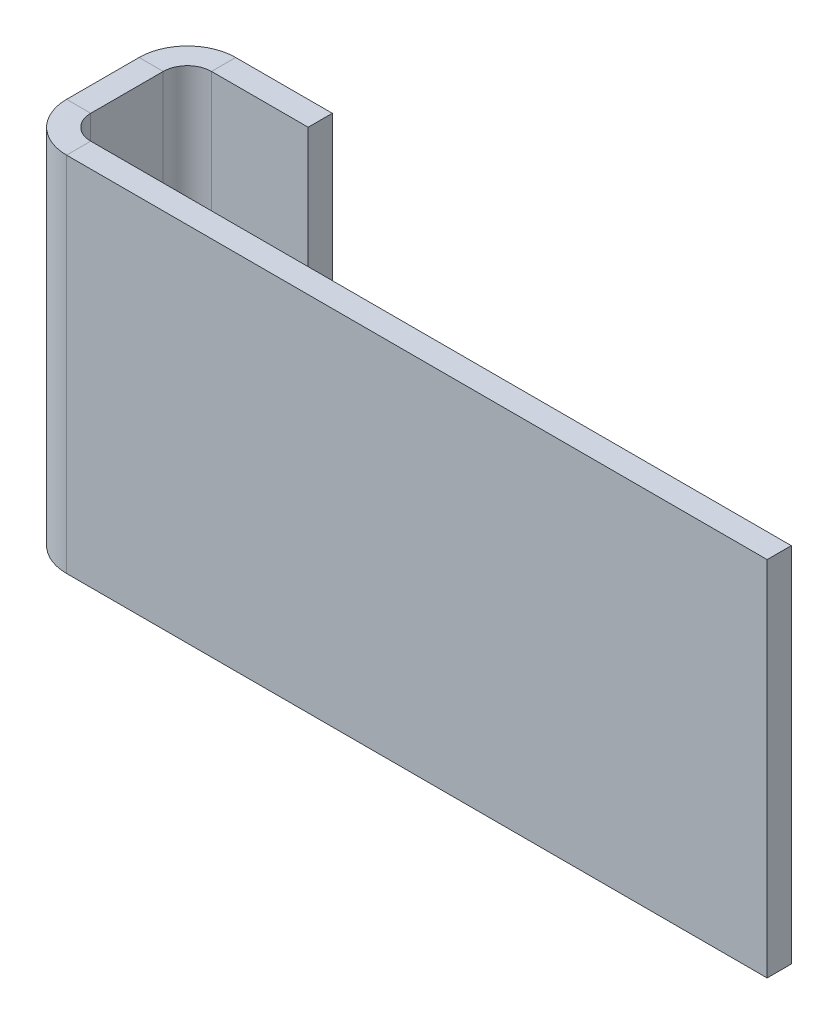
ISO-10303-21;
HEADER;
FILE_DESCRIPTION(('STEP AP214'),'2;1');
FILE_NAME('part.step','',(''),(''),'','','');
FILE_SCHEMA(('AUTOMOTIVE_DESIGN { 1 0 10303 214 1 1 1 1 }'));
ENDSEC;
DATA;
#1=APPLICATION_CONTEXT('core data for automotive mechanical design processes');
#2=APPLICATION_PROTOCOL_DEFINITION('international standard','automotive_design',2000,#1);
#3=PRODUCT_CONTEXT('',#1,'mechanical');
#4=PRODUCT('Part','Part','',(#3));
#5=PRODUCT_RELATED_PRODUCT_CATEGORY('part','',(#4));
#6=PRODUCT_DEFINITION_FORMATION('','',#4);
#7=PRODUCT_DEFINITION_CONTEXT('part definition',#1,'design');
#8=PRODUCT_DEFINITION('design','',#6,#7);
#9=PRODUCT_DEFINITION_SHAPE('','',#8);
#10=(LENGTH_UNIT() NAMED_UNIT(*) SI_UNIT(.MILLI.,.METRE.));
#11=(NAMED_UNIT(*) PLANE_ANGLE_UNIT() SI_UNIT($,.RADIAN.));
#12=(NAMED_UNIT(*) SI_UNIT($,.STERADIAN.) SOLID_ANGLE_UNIT());
#13=UNCERTAINTY_MEASURE_WITH_UNIT(LENGTH_MEASURE(1.E-05),#10,'distance_accuracy_value','');
#14=(GEOMETRIC_REPRESENTATION_CONTEXT(3) GLOBAL_UNCERTAINTY_ASSIGNED_CONTEXT((#13)) GLOBAL_UNIT_ASSIGNED_CONTEXT((#10,
#11,#12)) REPRESENTATION_CONTEXT('',''));
#15=CARTESIAN_POINT('',(0.,0.,0.));
#16=DIRECTION('',(0.,0.,1.));
#17=DIRECTION('',(1.,0.,0.));
#18=AXIS2_PLACEMENT_3D('',#15,#16,#17);
#19=CARTESIAN_POINT('',(-32.,15.,-9.99999999999999));
#20=DIRECTION('',(0.,-1.,0.));
#21=DIRECTION('',(0.,0.,-1.));
#22=AXIS2_PLACEMENT_3D('',#19,#20,#21);
#23=PLANE('',#22);
#24=DIRECTION('',(-1.,0.,0.));
#25=VECTOR('',#24,1.);
#26=CARTESIAN_POINT('',(-30.,15.,-8.00000000000001));
#27=LINE('',#26,#25);
#28=CARTESIAN_POINT('',(-30.,15.,-8.00000000000001));
#29=VERTEX_POINT('',#28);
#30=CARTESIAN_POINT('',(-32.,15.,-8.));
#31=VERTEX_POINT('',#30);
#32=EDGE_CURVE('E179',#29,#31,#27,.T.);
#33=ORIENTED_EDGE('',*,*,#32,.T.);
#34=DIRECTION('',(0.,0.,-1.));
#35=VECTOR('',#34,1.);
#36=CARTESIAN_POINT('',(-32.,15.,-9.99999999999999));
#37=LINE('',#36,#35);
#38=CARTESIAN_POINT('',(-32.,15.,-1.99999999999998));
#39=VERTEX_POINT('',#38);
#40=EDGE_CURVE('E202',#39,#31,#37,.T.);
#41=ORIENTED_EDGE('',*,*,#40,.F.);
#42=DIRECTION('',(-1.,0.,0.));
#43=VECTOR('',#42,1.);
#44=CARTESIAN_POINT('',(-30.,15.,-1.99999999999999));
#45=LINE('',#44,#43);
#46=CARTESIAN_POINT('',(-30.,15.,-1.99999999999999));
#47=VERTEX_POINT('',#46);
#48=EDGE_CURVE('E193',#47,#39,#45,.T.);
#49=ORIENTED_EDGE('',*,*,#48,.F.);
#50=DIRECTION('',(0.,0.,-1.));
#51=VECTOR('',#50,1.);
#52=CARTESIAN_POINT('',(-30.,15.,-10.));
#53=LINE('',#52,#51);
#54=EDGE_CURVE('E201',#47,#29,#53,.T.);
#55=ORIENTED_EDGE('',*,*,#54,.T.);
#56=EDGE_LOOP('',(#33,#41,#49,#55));
#57=FACE_BOUND('',#56,.T.);
#58=ADVANCED_FACE('F33',(#57),#23,.F.);
#59=CARTESIAN_POINT('',(-32.,-15.,0.));
#60=DIRECTION('',(0.,1.,0.));
#61=DIRECTION('',(0.,0.,1.));
#62=AXIS2_PLACEMENT_3D('',#59,#60,#61);
#63=PLANE('',#62);
#64=DIRECTION('',(-1.,0.,0.));
#65=VECTOR('',#64,1.);
#66=CARTESIAN_POINT('',(-30.,-15.,-8.00000000000001));
#67=LINE('',#66,#65);
#68=CARTESIAN_POINT('',(-30.,-15.,-8.00000000000001));
#69=VERTEX_POINT('',#68);
#70=CARTESIAN_POINT('',(-32.,-15.,-8.));
#71=VERTEX_POINT('',#70);
#72=EDGE_CURVE('E185',#69,#71,#67,.T.);
#73=ORIENTED_EDGE('',*,*,#72,.F.);
#74=DIRECTION('',(0.,0.,1.));
#75=VECTOR('',#74,1.);
#76=CARTESIAN_POINT('',(-30.,-15.,0.));
#77=LINE('',#76,#75);
#78=CARTESIAN_POINT('',(-30.,-15.,-1.99999999999999));
#79=VERTEX_POINT('',#78);
#80=EDGE_CURVE('E205',#69,#79,#77,.T.);
#81=ORIENTED_EDGE('',*,*,#80,.T.);
#82=DIRECTION('',(-1.,0.,0.));
#83=VECTOR('',#82,1.);
#84=CARTESIAN_POINT('',(-30.,-15.,-1.99999999999999));
#85=LINE('',#84,#83);
#86=CARTESIAN_POINT('',(-32.,-15.,-1.99999999999998));
#87=VERTEX_POINT('',#86);
#88=EDGE_CURVE('E188',#79,#87,#85,.T.);
#89=ORIENTED_EDGE('',*,*,#88,.T.);
#90=DIRECTION('',(0.,0.,1.));
#91=VECTOR('',#90,1.);
#92=CARTESIAN_POINT('',(-32.,-15.,0.));
#93=LINE('',#92,#91);
#94=EDGE_CURVE('E204',#71,#87,#93,.T.);
#95=ORIENTED_EDGE('',*,*,#94,.F.);
#96=EDGE_LOOP('',(#73,#81,#89,#95));
#97=FACE_BOUND('',#96,.T.);
#98=ADVANCED_FACE('F287',(#97),#63,.F.);
#99=CARTESIAN_POINT('',(-32.,15.,0.));
#100=DIRECTION('',(1.,0.,0.));
#101=DIRECTION('',(0.,0.,-1.));
#102=AXIS2_PLACEMENT_3D('',#99,#100,#101);
#103=PLANE('',#102);
#104=DIRECTION('',(0.,1.,0.));
#105=VECTOR('',#104,1.);
#106=CARTESIAN_POINT('',(-32.,15.,-8.));
#107=LINE('',#106,#105);
#108=EDGE_CURVE('E132',#31,#71,#107,.F.);
#109=ORIENTED_EDGE('',*,*,#108,.T.);
#110=ORIENTED_EDGE('',*,*,#94,.T.);
#111=DIRECTION('',(0.,-1.,0.));
#112=VECTOR('',#111,1.);
#113=CARTESIAN_POINT('',(-32.,15.,-1.99999999999998));
#114=LINE('',#113,#112);
#115=EDGE_CURVE('E196',#39,#87,#114,.T.);
#116=ORIENTED_EDGE('',*,*,#115,.F.);
#117=ORIENTED_EDGE('',*,*,#40,.T.);
#118=EDGE_LOOP('',(#109,#110,#116,#117));
#119=FACE_BOUND('',#118,.T.);
#120=ADVANCED_FACE('F269',(#119),#103,.F.);
#121=CARTESIAN_POINT('',(-30.,15.,0.));
#122=DIRECTION('',(1.,0.,0.));
#123=DIRECTION('',(0.,0.,-1.));
#124=AXIS2_PLACEMENT_3D('',#121,#122,#123);
#125=PLANE('',#124);
#126=ORIENTED_EDGE('',*,*,#80,.F.);
#127=DIRECTION('',(0.,1.,0.));
#128=VECTOR('',#127,1.);
#129=CARTESIAN_POINT('',(-30.,15.,-8.00000000000001));
#130=LINE('',#129,#128);
#131=EDGE_CURVE('E48',#29,#69,#130,.F.);
#132=ORIENTED_EDGE('',*,*,#131,.F.);
#133=ORIENTED_EDGE('',*,*,#54,.F.);
#134=DIRECTION('',(0.,1.,0.));
#135=VECTOR('',#134,1.);
#136=CARTESIAN_POINT('',(-30.,-15.,-1.99999999999999));
#137=LINE('',#136,#135);
#138=EDGE_CURVE('E191',#79,#47,#137,.T.);
#139=ORIENTED_EDGE('',*,*,#138,.F.);
#140=EDGE_LOOP('',(#126,#132,#133,#139));
#141=FACE_BOUND('',#140,.T.);
#142=ADVANCED_FACE('F289',(#141),#125,.T.);
#143=CARTESIAN_POINT('',(-30.,15.,2.));
#144=DIRECTION('',(0.,-1.,0.));
#145=DIRECTION('',(0.,0.,-1.));
#146=AXIS2_PLACEMENT_3D('',#143,#144,#145);
#147=PLANE('',#146);
#148=DIRECTION('',(0.,0.,1.));
#149=VECTOR('',#148,1.);
#150=CARTESIAN_POINT('',(-28.,15.,0.));
#151=LINE('',#150,#149);
#152=CARTESIAN_POINT('',(-28.,15.,0.));
#153=VERTEX_POINT('',#152);
#154=CARTESIAN_POINT('',(-28.,15.,2.));
#155=VERTEX_POINT('',#154);
#156=EDGE_CURVE('E216',#153,#155,#151,.T.);
#157=ORIENTED_EDGE('',*,*,#156,.T.);
#158=DIRECTION('',(-1.,0.,0.));
#159=VECTOR('',#158,1.);
#160=CARTESIAN_POINT('',(-30.,15.,2.));
#161=LINE('',#160,#159);
#162=CARTESIAN_POINT('',(30.,15.,2.));
#163=VERTEX_POINT('',#162);
#164=EDGE_CURVE('E234',#163,#155,#161,.T.);
#165=ORIENTED_EDGE('',*,*,#164,.F.);
#166=DIRECTION('',(0.,0.,-1.));
#167=VECTOR('',#166,1.);
#168=CARTESIAN_POINT('',(30.,15.,2.));
#169=LINE('',#168,#167);
#170=CARTESIAN_POINT('',(30.,15.,0.));
#171=VERTEX_POINT('',#170);
#172=EDGE_CURVE('E11',#163,#171,#169,.T.);
#173=ORIENTED_EDGE('',*,*,#172,.T.);
#174=DIRECTION('',(-1.,0.,0.));
#175=VECTOR('',#174,1.);
#176=CARTESIAN_POINT('',(-30.,15.,0.));
#177=LINE('',#176,#175);
#178=EDGE_CURVE('E241',#171,#153,#177,.T.);
#179=ORIENTED_EDGE('',*,*,#178,.T.);
#180=EDGE_LOOP('',(#157,#165,#173,#179));
#181=FACE_BOUND('',#180,.T.);
#182=ADVANCED_FACE('F254',(#181),#147,.F.);
#183=CARTESIAN_POINT('',(-30.,-15.,2.));
#184=DIRECTION('',(0.,1.,0.));
#185=DIRECTION('',(0.,0.,1.));
#186=AXIS2_PLACEMENT_3D('',#183,#184,#185);
#187=PLANE('',#186);
#188=DIRECTION('',(0.,0.,1.));
#189=VECTOR('',#188,1.);
#190=CARTESIAN_POINT('',(-28.,-15.,0.));
#191=LINE('',#190,#189);
#192=CARTESIAN_POINT('',(-28.,-15.,0.));
#193=VERTEX_POINT('',#192);
#194=CARTESIAN_POINT('',(-28.,-15.,2.));
#195=VERTEX_POINT('',#194);
#196=EDGE_CURVE('E225',#193,#195,#191,.T.);
#197=ORIENTED_EDGE('',*,*,#196,.F.);
#198=DIRECTION('',(1.,0.,0.));
#199=VECTOR('',#198,1.);
#200=CARTESIAN_POINT('',(-30.,-15.,0.));
#201=LINE('',#200,#199);
#202=CARTESIAN_POINT('',(30.,-15.,0.));
#203=VERTEX_POINT('',#202);
#204=EDGE_CURVE('E235',#193,#203,#201,.T.);
#205=ORIENTED_EDGE('',*,*,#204,.T.);
#206=DIRECTION('',(0.,0.,-1.));
#207=VECTOR('',#206,1.);
#208=CARTESIAN_POINT('',(30.,-15.,2.));
#209=LINE('',#208,#207);
#210=CARTESIAN_POINT('',(30.,-15.,2.));
#211=VERTEX_POINT('',#210);
#212=EDGE_CURVE('E41',#211,#203,#209,.T.);
#213=ORIENTED_EDGE('',*,*,#212,.F.);
#214=DIRECTION('',(1.,0.,0.));
#215=VECTOR('',#214,1.);
#216=CARTESIAN_POINT('',(-30.,-15.,2.));
#217=LINE('',#216,#215);
#218=EDGE_CURVE('E237',#195,#211,#217,.T.);
#219=ORIENTED_EDGE('',*,*,#218,.F.);
#220=EDGE_LOOP('',(#197,#205,#213,#219));
#221=FACE_BOUND('',#220,.T.);
#222=ADVANCED_FACE('F258',(#221),#187,.F.);
#223=CARTESIAN_POINT('',(30.,15.,2.));
#224=DIRECTION('',(0.,0.,-1.));
#225=DIRECTION('',(-1.,0.,0.));
#226=AXIS2_PLACEMENT_3D('',#223,#224,#225);
#227=PLANE('',#226);
#228=DIRECTION('',(0.,1.,0.));
#229=VECTOR('',#228,1.);
#230=CARTESIAN_POINT('',(-28.,15.,2.));
#231=LINE('',#230,#229);
#232=EDGE_CURVE('E210',#155,#195,#231,.F.);
#233=ORIENTED_EDGE('',*,*,#232,.T.);
#234=ORIENTED_EDGE('',*,*,#218,.T.);
#235=DIRECTION('',(0.,1.,0.));
#236=VECTOR('',#235,1.);
#237=CARTESIAN_POINT('',(30.,-15.,2.));
#238=LINE('',#237,#236);
#239=EDGE_CURVE('E231',#211,#163,#238,.T.);
#240=ORIENTED_EDGE('',*,*,#239,.T.);
#241=ORIENTED_EDGE('',*,*,#164,.T.);
#242=EDGE_LOOP('',(#233,#234,#240,#241));
#243=FACE_BOUND('',#242,.T.);
#244=ADVANCED_FACE('F257',(#243),#227,.F.);
#245=CARTESIAN_POINT('',(30.,15.,0.));
#246=DIRECTION('',(0.,0.,-1.));
#247=DIRECTION('',(-1.,0.,0.));
#248=AXIS2_PLACEMENT_3D('',#245,#246,#247);
#249=PLANE('',#248);
#250=ORIENTED_EDGE('',*,*,#204,.F.);
#251=DIRECTION('',(0.,1.,0.));
#252=VECTOR('',#251,1.);
#253=CARTESIAN_POINT('',(-28.,15.,0.));
#254=LINE('',#253,#252);
#255=EDGE_CURVE('E56',#153,#193,#254,.F.);
#256=ORIENTED_EDGE('',*,*,#255,.F.);
#257=ORIENTED_EDGE('',*,*,#178,.F.);
#258=DIRECTION('',(0.,1.,0.));
#259=VECTOR('',#258,1.);
#260=CARTESIAN_POINT('',(30.,-15.,0.));
#261=LINE('',#260,#259);
#262=EDGE_CURVE('E228',#203,#171,#261,.T.);
#263=ORIENTED_EDGE('',*,*,#262,.F.);
#264=EDGE_LOOP('',(#250,#256,#257,#263));
#265=FACE_BOUND('',#264,.T.);
#266=ADVANCED_FACE('F251',(#265),#249,.T.);
#267=CARTESIAN_POINT('',(30.,-15.,2.));
#268=DIRECTION('',(-1.,0.,0.));
#269=DIRECTION('',(0.,0.,1.));
#270=AXIS2_PLACEMENT_3D('',#267,#268,#269);
#271=PLANE('',#270);
#272=ORIENTED_EDGE('',*,*,#262,.T.);
#273=ORIENTED_EDGE('',*,*,#172,.F.);
#274=ORIENTED_EDGE('',*,*,#239,.F.);
#275=ORIENTED_EDGE('',*,*,#212,.T.);
#276=EDGE_LOOP('',(#272,#273,#274,#275));
#277=FACE_BOUND('',#276,.T.);
#278=ADVANCED_FACE('F35',(#277),#271,.F.);
#279=CARTESIAN_POINT('',(-28.,-15.,-2.));
#280=DIRECTION('',(0.,-1.,0.));
#281=DIRECTION('',(0.,0.,-1.));
#282=AXIS2_PLACEMENT_3D('',#279,#280,#281);
#283=PLANE('',#282);
#284=ORIENTED_EDGE('',*,*,#88,.F.);
#285=CARTESIAN_POINT('',(-28.,-15.,-2.));
#286=DIRECTION('',(0.,1.,0.));
#287=DIRECTION('',(0.,0.,1.));
#288=AXIS2_PLACEMENT_3D('',#285,#286,#287);
#289=CIRCLE('',#288,2.);
#290=EDGE_CURVE('E219',#193,#79,#289,.F.);
#291=ORIENTED_EDGE('',*,*,#290,.F.);
#292=ORIENTED_EDGE('',*,*,#196,.T.);
#293=CARTESIAN_POINT('',(-28.,-15.,-2.));
#294=DIRECTION('',(0.,1.,0.));
#295=DIRECTION('',(0.,0.,1.));
#296=AXIS2_PLACEMENT_3D('',#293,#294,#295);
#297=CIRCLE('',#296,4.);
#298=EDGE_CURVE('E212',#195,#87,#297,.F.);
#299=ORIENTED_EDGE('',*,*,#298,.T.);
#300=EDGE_LOOP('',(#284,#291,#292,#299));
#301=FACE_BOUND('',#300,.T.);
#302=ADVANCED_FACE('F263',(#301),#283,.T.);
#303=CARTESIAN_POINT('',(-28.,15.,-2.));
#304=DIRECTION('',(0.,-1.,0.));
#305=DIRECTION('',(0.,0.,-1.));
#306=AXIS2_PLACEMENT_3D('',#303,#304,#305);
#307=PLANE('',#306);
#308=CARTESIAN_POINT('',(-28.,15.,-2.));
#309=DIRECTION('',(0.,1.,0.));
#310=DIRECTION('',(0.,0.,1.));
#311=AXIS2_PLACEMENT_3D('',#308,#309,#310);
#312=CIRCLE('',#311,2.);
#313=EDGE_CURVE('E207',#47,#153,#312,.T.);
#314=ORIENTED_EDGE('',*,*,#313,.F.);
#315=ORIENTED_EDGE('',*,*,#48,.T.);
#316=CARTESIAN_POINT('',(-28.,15.,-2.));
#317=DIRECTION('',(0.,1.,0.));
#318=DIRECTION('',(0.,0.,1.));
#319=AXIS2_PLACEMENT_3D('',#316,#317,#318);
#320=CIRCLE('',#319,4.);
#321=EDGE_CURVE('E213',#39,#155,#320,.T.);
#322=ORIENTED_EDGE('',*,*,#321,.T.);
#323=ORIENTED_EDGE('',*,*,#156,.F.);
#324=EDGE_LOOP('',(#314,#315,#322,#323));
#325=FACE_BOUND('',#324,.T.);
#326=ADVANCED_FACE('F294',(#325),#307,.F.);
#327=CARTESIAN_POINT('',(-28.,15.,-2.));
#328=DIRECTION('',(0.,1.,0.));
#329=DIRECTION('',(-1.,0.,0.));
#330=AXIS2_PLACEMENT_3D('',#327,#328,#329);
#331=CYLINDRICAL_SURFACE('',#330,4.);
#332=ORIENTED_EDGE('',*,*,#232,.F.);
#333=ORIENTED_EDGE('',*,*,#321,.F.);
#334=ORIENTED_EDGE('',*,*,#115,.T.);
#335=ORIENTED_EDGE('',*,*,#298,.F.);
#336=EDGE_LOOP('',(#332,#333,#334,#335));
#337=FACE_BOUND('',#336,.T.);
#338=ADVANCED_FACE('F265',(#337),#331,.T.);
#339=CARTESIAN_POINT('',(-28.,15.,-2.));
#340=DIRECTION('',(0.,1.,0.));
#341=DIRECTION('',(-1.,0.,0.));
#342=AXIS2_PLACEMENT_3D('',#339,#340,#341);
#343=CYLINDRICAL_SURFACE('',#342,2.);
#344=ORIENTED_EDGE('',*,*,#255,.T.);
#345=ORIENTED_EDGE('',*,*,#290,.T.);
#346=ORIENTED_EDGE('',*,*,#138,.T.);
#347=ORIENTED_EDGE('',*,*,#313,.T.);
#348=EDGE_LOOP('',(#344,#345,#346,#347));
#349=FACE_BOUND('',#348,.T.);
#350=ADVANCED_FACE('F292',(#349),#343,.F.);
#351=CARTESIAN_POINT('',(-28.,-15.,-8.00000000000001));
#352=DIRECTION('',(0.,-1.,0.));
#353=DIRECTION('',(0.,0.,-1.));
#354=AXIS2_PLACEMENT_3D('',#351,#352,#353);
#355=PLANE('',#354);
#356=DIRECTION('',(0.,0.,-1.));
#357=VECTOR('',#356,1.);
#358=CARTESIAN_POINT('',(-28.,-15.,-10.));
#359=LINE('',#358,#357);
#360=CARTESIAN_POINT('',(-28.,-15.,-10.));
#361=VERTEX_POINT('',#360);
#362=CARTESIAN_POINT('',(-28.0000000000001,-15.,-12.));
#363=VERTEX_POINT('',#362);
#364=EDGE_CURVE('E279',#361,#363,#359,.T.);
#365=ORIENTED_EDGE('',*,*,#364,.F.);
#366=CARTESIAN_POINT('',(-28.,-15.,-8.00000000000001));
#367=DIRECTION('',(0.,1.,0.));
#368=DIRECTION('',(0.,0.,1.));
#369=AXIS2_PLACEMENT_3D('',#366,#367,#368);
#370=CIRCLE('',#369,2.);
#371=EDGE_CURVE('E135',#69,#361,#370,.F.);
#372=ORIENTED_EDGE('',*,*,#371,.F.);
#373=ORIENTED_EDGE('',*,*,#72,.T.);
#374=CARTESIAN_POINT('',(-28.,-15.,-8.00000000000001));
#375=DIRECTION('',(0.,1.,0.));
#376=DIRECTION('',(0.,0.,1.));
#377=AXIS2_PLACEMENT_3D('',#374,#375,#376);
#378=CIRCLE('',#377,4.);
#379=EDGE_CURVE('E178',#71,#363,#378,.F.);
#380=ORIENTED_EDGE('',*,*,#379,.T.);
#381=EDGE_LOOP('',(#365,#372,#373,#380));
#382=FACE_BOUND('',#381,.T.);
#383=ADVANCED_FACE('F285',(#382),#355,.T.);
#384=CARTESIAN_POINT('',(-28.,15.,-8.00000000000001));
#385=DIRECTION('',(0.,-1.,0.));
#386=DIRECTION('',(0.,0.,-1.));
#387=AXIS2_PLACEMENT_3D('',#384,#385,#386);
#388=PLANE('',#387);
#389=CARTESIAN_POINT('',(-28.,15.,-8.00000000000001));
#390=DIRECTION('',(0.,1.,0.));
#391=DIRECTION('',(0.,0.,1.));
#392=AXIS2_PLACEMENT_3D('',#389,#390,#391);
#393=CIRCLE('',#392,2.);
#394=CARTESIAN_POINT('',(-28.,15.,-10.));
#395=VERTEX_POINT('',#394);
#396=EDGE_CURVE('E142',#395,#29,#393,.T.);
#397=ORIENTED_EDGE('',*,*,#396,.F.);
#398=DIRECTION('',(0.,0.,-1.));
#399=VECTOR('',#398,1.);
#400=CARTESIAN_POINT('',(-28.,15.,-10.));
#401=LINE('',#400,#399);
#402=CARTESIAN_POINT('',(-28.,15.,-12.));
#403=VERTEX_POINT('',#402);
#404=EDGE_CURVE('E139',#395,#403,#401,.T.);
#405=ORIENTED_EDGE('',*,*,#404,.T.);
#406=CARTESIAN_POINT('',(-28.,15.,-8.00000000000001));
#407=DIRECTION('',(0.,1.,0.));
#408=DIRECTION('',(0.,0.,1.));
#409=AXIS2_PLACEMENT_3D('',#406,#407,#408);
#410=CIRCLE('',#409,4.);
#411=EDGE_CURVE('E125',#403,#31,#410,.T.);
#412=ORIENTED_EDGE('',*,*,#411,.T.);
#413=ORIENTED_EDGE('',*,*,#32,.F.);
#414=EDGE_LOOP('',(#397,#405,#412,#413));
#415=FACE_BOUND('',#414,.T.);
#416=ADVANCED_FACE('F140',(#415),#388,.F.);
#417=CARTESIAN_POINT('',(-28.,15.,-8.00000000000001));
#418=DIRECTION('',(0.,1.,0.));
#419=DIRECTION('',(0.,0.,-1.));
#420=AXIS2_PLACEMENT_3D('',#417,#418,#419);
#421=CYLINDRICAL_SURFACE('',#420,4.);
#422=ORIENTED_EDGE('',*,*,#108,.F.);
#423=ORIENTED_EDGE('',*,*,#411,.F.);
#424=DIRECTION('',(0.,-1.,0.));
#425=VECTOR('',#424,1.);
#426=CARTESIAN_POINT('',(-28.,15.,-12.));
#427=LINE('',#426,#425);
#428=EDGE_CURVE('E130',#403,#363,#427,.T.);
#429=ORIENTED_EDGE('',*,*,#428,.T.);
#430=ORIENTED_EDGE('',*,*,#379,.F.);
#431=EDGE_LOOP('',(#422,#423,#429,#430));
#432=FACE_BOUND('',#431,.T.);
#433=ADVANCED_FACE('F127',(#432),#421,.T.);
#434=CARTESIAN_POINT('',(-28.,15.,-8.00000000000001));
#435=DIRECTION('',(0.,1.,0.));
#436=DIRECTION('',(0.,0.,-1.));
#437=AXIS2_PLACEMENT_3D('',#434,#435,#436);
#438=CYLINDRICAL_SURFACE('',#437,2.);
#439=ORIENTED_EDGE('',*,*,#131,.T.);
#440=ORIENTED_EDGE('',*,*,#371,.T.);
#441=DIRECTION('',(0.,1.,0.));
#442=VECTOR('',#441,1.);
#443=CARTESIAN_POINT('',(-28.,-15.,-10.));
#444=LINE('',#443,#442);
#445=EDGE_CURVE('E146',#361,#395,#444,.T.);
#446=ORIENTED_EDGE('',*,*,#445,.T.);
#447=ORIENTED_EDGE('',*,*,#396,.T.);
#448=EDGE_LOOP('',(#439,#440,#446,#447));
#449=FACE_BOUND('',#448,.T.);
#450=ADVANCED_FACE('F274',(#449),#438,.F.);
#451=CARTESIAN_POINT('',(-20.,15.,-12.0000000000001));
#452=DIRECTION('',(0.,-1.,0.));
#453=DIRECTION('',(0.,0.,-1.));
#454=AXIS2_PLACEMENT_3D('',#451,#452,#453);
#455=PLANE('',#454);
#456=ORIENTED_EDGE('',*,*,#404,.F.);
#457=DIRECTION('',(1.,0.,0.));
#458=VECTOR('',#457,1.);
#459=CARTESIAN_POINT('',(-20.,15.,-10.0000000000001));
#460=LINE('',#459,#458);
#461=CARTESIAN_POINT('',(-20.,15.,-10.0000000000001));
#462=VERTEX_POINT('',#461);
#463=EDGE_CURVE('E155',#395,#462,#460,.T.);
#464=ORIENTED_EDGE('',*,*,#463,.T.);
#465=DIRECTION('',(0.,0.,1.));
#466=VECTOR('',#465,1.);
#467=CARTESIAN_POINT('',(-20.,15.,-12.0000000000001));
#468=LINE('',#467,#466);
#469=CARTESIAN_POINT('',(-20.,15.,-12.0000000000001));
#470=VERTEX_POINT('',#469);
#471=EDGE_CURVE('E160',#470,#462,#468,.T.);
#472=ORIENTED_EDGE('',*,*,#471,.F.);
#473=DIRECTION('',(1.,0.,0.));
#474=VECTOR('',#473,1.);
#475=CARTESIAN_POINT('',(-20.,15.,-12.0000000000001));
#476=LINE('',#475,#474);
#477=EDGE_CURVE('E151',#403,#470,#476,.T.);
#478=ORIENTED_EDGE('',*,*,#477,.F.);
#479=EDGE_LOOP('',(#456,#464,#472,#478));
#480=FACE_BOUND('',#479,.T.);
#481=ADVANCED_FACE('F158',(#480),#455,.F.);
#482=CARTESIAN_POINT('',(-30.,-15.,-12.));
#483=DIRECTION('',(0.,1.,0.));
#484=DIRECTION('',(0.,0.,1.));
#485=AXIS2_PLACEMENT_3D('',#482,#483,#484);
#486=PLANE('',#485);
#487=ORIENTED_EDGE('',*,*,#364,.T.);
#488=DIRECTION('',(-1.,0.,0.));
#489=VECTOR('',#488,1.);
#490=CARTESIAN_POINT('',(-30.,-15.,-12.));
#491=LINE('',#490,#489);
#492=CARTESIAN_POINT('',(-20.,-15.,-12.0000000000001));
#493=VERTEX_POINT('',#492);
#494=EDGE_CURVE('E154',#493,#363,#491,.T.);
#495=ORIENTED_EDGE('',*,*,#494,.F.);
#496=DIRECTION('',(0.,0.,1.));
#497=VECTOR('',#496,1.);
#498=CARTESIAN_POINT('',(-20.,-15.,-12.0000000000001));
#499=LINE('',#498,#497);
#500=CARTESIAN_POINT('',(-20.,-15.,-10.0000000000001));
#501=VERTEX_POINT('',#500);
#502=EDGE_CURVE('E171',#493,#501,#499,.T.);
#503=ORIENTED_EDGE('',*,*,#502,.T.);
#504=DIRECTION('',(-1.,0.,0.));
#505=VECTOR('',#504,1.);
#506=CARTESIAN_POINT('',(-30.,-15.,-10.));
#507=LINE('',#506,#505);
#508=EDGE_CURVE('E162',#501,#361,#507,.T.);
#509=ORIENTED_EDGE('',*,*,#508,.T.);
#510=EDGE_LOOP('',(#487,#495,#503,#509));
#511=FACE_BOUND('',#510,.T.);
#512=ADVANCED_FACE('F283',(#511),#486,.F.);
#513=CARTESIAN_POINT('',(-30.,15.,-12.));
#514=DIRECTION('',(0.,0.,1.));
#515=DIRECTION('',(1.,0.,0.));
#516=AXIS2_PLACEMENT_3D('',#513,#514,#515);
#517=PLANE('',#516);
#518=ORIENTED_EDGE('',*,*,#428,.F.);
#519=ORIENTED_EDGE('',*,*,#477,.T.);
#520=DIRECTION('',(0.,-1.,0.));
#521=VECTOR('',#520,1.);
#522=CARTESIAN_POINT('',(-20.,-15.,-12.0000000000001));
#523=LINE('',#522,#521);
#524=EDGE_CURVE('E161',#470,#493,#523,.T.);
#525=ORIENTED_EDGE('',*,*,#524,.T.);
#526=ORIENTED_EDGE('',*,*,#494,.T.);
#527=EDGE_LOOP('',(#518,#519,#525,#526));
#528=FACE_BOUND('',#527,.T.);
#529=ADVANCED_FACE('F150',(#528),#517,.F.);
#530=CARTESIAN_POINT('',(-30.,15.,-10.));
#531=DIRECTION('',(0.,0.,1.));
#532=DIRECTION('',(1.,0.,0.));
#533=AXIS2_PLACEMENT_3D('',#530,#531,#532);
#534=PLANE('',#533);
#535=ORIENTED_EDGE('',*,*,#463,.F.);
#536=ORIENTED_EDGE('',*,*,#445,.F.);
#537=ORIENTED_EDGE('',*,*,#508,.F.);
#538=DIRECTION('',(0.,-1.,0.));
#539=VECTOR('',#538,1.);
#540=CARTESIAN_POINT('',(-20.,-15.,-10.0000000000001));
#541=LINE('',#540,#539);
#542=EDGE_CURVE('E166',#462,#501,#541,.T.);
#543=ORIENTED_EDGE('',*,*,#542,.F.);
#544=EDGE_LOOP('',(#535,#536,#537,#543));
#545=FACE_BOUND('',#544,.T.);
#546=ADVANCED_FACE('F330',(#545),#534,.T.);
#547=CARTESIAN_POINT('',(-20.,-15.,-12.0000000000001));
#548=DIRECTION('',(-1.,0.,0.));
#549=DIRECTION('',(0.,0.,1.));
#550=AXIS2_PLACEMENT_3D('',#547,#548,#549);
#551=PLANE('',#550);
#552=ORIENTED_EDGE('',*,*,#542,.T.);
#553=ORIENTED_EDGE('',*,*,#502,.F.);
#554=ORIENTED_EDGE('',*,*,#524,.F.);
#555=ORIENTED_EDGE('',*,*,#471,.T.);
#556=EDGE_LOOP('',(#552,#553,#554,#555));
#557=FACE_BOUND('',#556,.T.);
#558=ADVANCED_FACE('F327',(#557),#551,.F.);
#559=CLOSED_SHELL('',(#58,#98,#120,#142,#182,#222,#244,#266,#278,#302,#326,#338,#350,#383,#416,
#433,#450,#481,#512,#529,#546,#558));
#560=MANIFOLD_SOLID_BREP('B2',#559);
#561=ADVANCED_BREP_SHAPE_REPRESENTATION('',(#18,#560),#14);
#562=SHAPE_DEFINITION_REPRESENTATION(#9,#561);
ENDSEC;
END-ISO-10303-21;
